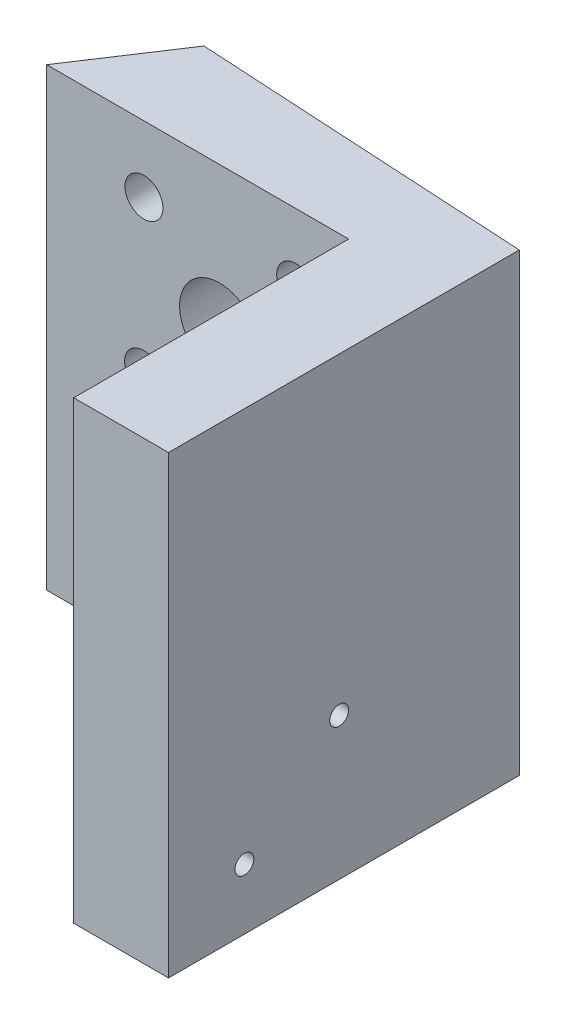
ISO-10303-21;
HEADER;
FILE_DESCRIPTION(('STEP AP214'),'2;1');
FILE_NAME('part.step','',(''),(''),'','','');
FILE_SCHEMA(('AUTOMOTIVE_DESIGN { 1 0 10303 214 1 1 1 1 }'));
ENDSEC;
DATA;
#1=APPLICATION_CONTEXT('core data for automotive mechanical design processes');
#2=APPLICATION_PROTOCOL_DEFINITION('international standard','automotive_design',2000,#1);
#3=PRODUCT_CONTEXT('',#1,'mechanical');
#4=PRODUCT('Part','Part','',(#3));
#5=PRODUCT_RELATED_PRODUCT_CATEGORY('part','',(#4));
#6=PRODUCT_DEFINITION_FORMATION('','',#4);
#7=PRODUCT_DEFINITION_CONTEXT('part definition',#1,'design');
#8=PRODUCT_DEFINITION('design','',#6,#7);
#9=PRODUCT_DEFINITION_SHAPE('','',#8);
#10=(LENGTH_UNIT() NAMED_UNIT(*) SI_UNIT(.MILLI.,.METRE.));
#11=(NAMED_UNIT(*) PLANE_ANGLE_UNIT() SI_UNIT($,.RADIAN.));
#12=(NAMED_UNIT(*) SI_UNIT($,.STERADIAN.) SOLID_ANGLE_UNIT());
#13=UNCERTAINTY_MEASURE_WITH_UNIT(LENGTH_MEASURE(1.E-05),#10,'distance_accuracy_value','');
#14=(GEOMETRIC_REPRESENTATION_CONTEXT(3) GLOBAL_UNCERTAINTY_ASSIGNED_CONTEXT((#13)) GLOBAL_UNIT_ASSIGNED_CONTEXT((#10,
#11,#12)) REPRESENTATION_CONTEXT('',''));
#15=CARTESIAN_POINT('',(0.,0.,0.));
#16=DIRECTION('',(0.,0.,1.));
#17=DIRECTION('',(1.,0.,0.));
#18=AXIS2_PLACEMENT_3D('',#15,#16,#17);
#19=CARTESIAN_POINT('',(0.,48.,0.));
#20=DIRECTION('',(0.,0.,1.));
#21=DIRECTION('',(1.,0.,0.));
#22=AXIS2_PLACEMENT_3D('',#19,#20,#21);
#23=PLANE('',#22);
#24=CARTESIAN_POINT('',(-5.62968108342815,24.9790510727815,0.));
#25=DIRECTION('',(0.,0.,1.));
#26=DIRECTION('',(1.,0.,0.));
#27=AXIS2_PLACEMENT_3D('',#24,#25,#26);
#28=CIRCLE('',#27,2.);
#29=CARTESIAN_POINT('',(-3.62968108342815,24.9790510727815,0.));
#30=VERTEX_POINT('',#29);
#31=EDGE_CURVE('E145',#30,#30,#28,.T.);
#32=ORIENTED_EDGE('',*,*,#31,.F.);
#33=EDGE_LOOP('',(#32));
#34=FACE_BOUND('',#33,.T.);
#35=CARTESIAN_POINT('',(-21.5913355474178,41.0209489272188,0.));
#36=DIRECTION('',(0.,0.,1.));
#37=DIRECTION('',(1.,0.,0.));
#38=AXIS2_PLACEMENT_3D('',#35,#36,#37);
#39=CIRCLE('',#38,2.);
#40=CARTESIAN_POINT('',(-19.5913355474178,41.0209489272188,0.));
#41=VERTEX_POINT('',#40);
#42=EDGE_CURVE('E146',#41,#41,#39,.T.);
#43=ORIENTED_EDGE('',*,*,#42,.F.);
#44=EDGE_LOOP('',(#43));
#45=FACE_BOUND('',#44,.T.);
#46=CARTESIAN_POINT('',(-21.6314572426416,25.0191727680053,0.));
#47=DIRECTION('',(0.,0.,1.));
#48=DIRECTION('',(1.,0.,0.));
#49=AXIS2_PLACEMENT_3D('',#46,#47,#48);
#50=CIRCLE('',#49,2.);
#51=CARTESIAN_POINT('',(-19.6314572426416,25.0191727680053,0.));
#52=VERTEX_POINT('',#51);
#53=EDGE_CURVE('E149',#52,#52,#50,.T.);
#54=ORIENTED_EDGE('',*,*,#53,.F.);
#55=EDGE_LOOP('',(#54));
#56=FACE_BOUND('',#55,.T.);
#57=CARTESIAN_POINT('',(-13.6296810834282,32.9790510727815,0.));
#58=DIRECTION('',(0.,0.,1.));
#59=DIRECTION('',(1.,0.,0.));
#60=AXIS2_PLACEMENT_3D('',#57,#58,#59);
#61=CIRCLE('',#60,4.2);
#62=CARTESIAN_POINT('',(-9.42968108342816,32.9790510727815,0.));
#63=VERTEX_POINT('',#62);
#64=EDGE_CURVE('E152',#63,#63,#61,.T.);
#65=ORIENTED_EDGE('',*,*,#64,.F.);
#66=EDGE_LOOP('',(#65));
#67=FACE_BOUND('',#66,.T.);
#68=CARTESIAN_POINT('',(-5.58955938820431,40.9808272319949,0.));
#69=DIRECTION('',(0.,0.,1.));
#70=DIRECTION('',(1.,0.,0.));
#71=AXIS2_PLACEMENT_3D('',#68,#69,#70);
#72=CIRCLE('',#71,2.00000000000001);
#73=CARTESIAN_POINT('',(-3.5895593882043,40.9808272319949,0.));
#74=VERTEX_POINT('',#73);
#75=EDGE_CURVE('E141',#74,#74,#72,.T.);
#76=ORIENTED_EDGE('',*,*,#75,.F.);
#77=EDGE_LOOP('',(#76));
#78=FACE_BOUND('',#77,.T.);
#79=DIRECTION('',(-1.,0.,0.));
#80=VECTOR('',#79,1.);
#81=CARTESIAN_POINT('',(0.,0.,0.));
#82=LINE('',#81,#80);
#83=CARTESIAN_POINT('',(0.,0.,0.));
#84=VERTEX_POINT('',#83);
#85=CARTESIAN_POINT('',(-31.85,0.,0.));
#86=VERTEX_POINT('',#85);
#87=EDGE_CURVE('E130',#84,#86,#82,.T.);
#88=ORIENTED_EDGE('',*,*,#87,.F.);
#89=DIRECTION('',(0.,-1.,0.));
#90=VECTOR('',#89,1.);
#91=CARTESIAN_POINT('',(0.,48.,0.));
#92=LINE('',#91,#90);
#93=CARTESIAN_POINT('',(0.,48.,0.));
#94=VERTEX_POINT('',#93);
#95=EDGE_CURVE('E41',#94,#84,#92,.T.);
#96=ORIENTED_EDGE('',*,*,#95,.F.);
#97=DIRECTION('',(-1.,0.,0.));
#98=VECTOR('',#97,1.);
#99=CARTESIAN_POINT('',(0.,48.,0.));
#100=LINE('',#99,#98);
#101=CARTESIAN_POINT('',(-31.85,48.,0.));
#102=VERTEX_POINT('',#101);
#103=EDGE_CURVE('E113',#94,#102,#100,.T.);
#104=ORIENTED_EDGE('',*,*,#103,.T.);
#105=DIRECTION('',(0.,-1.,0.));
#106=VECTOR('',#105,1.);
#107=CARTESIAN_POINT('',(-31.85,48.,0.));
#108=LINE('',#107,#106);
#109=EDGE_CURVE('E11',#102,#86,#108,.T.);
#110=ORIENTED_EDGE('',*,*,#109,.T.);
#111=EDGE_LOOP('',(#88,#96,#104,#110));
#112=FACE_BOUND('',#111,.T.);
#113=ADVANCED_FACE('F33',(#34,#45,#56,#67,#78,#112),#23,.T.);
#114=CARTESIAN_POINT('',(0.,48.,0.));
#115=DIRECTION('',(1.,0.,0.));
#116=DIRECTION('',(0.,0.,-1.));
#117=AXIS2_PLACEMENT_3D('',#114,#115,#116);
#118=PLANE('',#117);
#119=DIRECTION('',(0.,0.,1.));
#120=VECTOR('',#119,1.);
#121=CARTESIAN_POINT('',(0.,0.,0.));
#122=LINE('',#121,#120);
#123=CARTESIAN_POINT('',(0.,0.,29.));
#124=VERTEX_POINT('',#123);
#125=EDGE_CURVE('E117',#84,#124,#122,.T.);
#126=ORIENTED_EDGE('',*,*,#125,.T.);
#127=DIRECTION('',(0.,-1.,0.));
#128=VECTOR('',#127,1.);
#129=CARTESIAN_POINT('',(0.,48.,29.));
#130=LINE('',#129,#128);
#131=CARTESIAN_POINT('',(0.,48.,29.));
#132=VERTEX_POINT('',#131);
#133=EDGE_CURVE('E122',#132,#124,#130,.T.);
#134=ORIENTED_EDGE('',*,*,#133,.F.);
#135=DIRECTION('',(0.,0.,1.));
#136=VECTOR('',#135,1.);
#137=CARTESIAN_POINT('',(0.,48.,0.));
#138=LINE('',#137,#136);
#139=EDGE_CURVE('E115',#94,#132,#138,.T.);
#140=ORIENTED_EDGE('',*,*,#139,.F.);
#141=ORIENTED_EDGE('',*,*,#95,.T.);
#142=EDGE_LOOP('',(#126,#134,#140,#141));
#143=FACE_BOUND('',#142,.T.);
#144=ADVANCED_FACE('F127',(#143),#118,.F.);
#145=CARTESIAN_POINT('',(0.,48.,29.));
#146=DIRECTION('',(0.,0.,-1.));
#147=DIRECTION('',(-1.,0.,0.));
#148=AXIS2_PLACEMENT_3D('',#145,#146,#147);
#149=PLANE('',#148);
#150=DIRECTION('',(1.,0.,0.));
#151=VECTOR('',#150,1.);
#152=CARTESIAN_POINT('',(0.,0.,29.));
#153=LINE('',#152,#151);
#154=CARTESIAN_POINT('',(10.,0.,29.));
#155=VERTEX_POINT('',#154);
#156=EDGE_CURVE('E74',#124,#155,#153,.T.);
#157=ORIENTED_EDGE('',*,*,#156,.T.);
#158=DIRECTION('',(0.,-1.,0.));
#159=VECTOR('',#158,1.);
#160=CARTESIAN_POINT('',(10.,48.,29.));
#161=LINE('',#160,#159);
#162=CARTESIAN_POINT('',(10.,48.,29.));
#163=VERTEX_POINT('',#162);
#164=EDGE_CURVE('E112',#163,#155,#161,.T.);
#165=ORIENTED_EDGE('',*,*,#164,.F.);
#166=DIRECTION('',(1.,0.,0.));
#167=VECTOR('',#166,1.);
#168=CARTESIAN_POINT('',(0.,48.,29.));
#169=LINE('',#168,#167);
#170=EDGE_CURVE('E57',#132,#163,#169,.T.);
#171=ORIENTED_EDGE('',*,*,#170,.F.);
#172=ORIENTED_EDGE('',*,*,#133,.T.);
#173=EDGE_LOOP('',(#157,#165,#171,#172));
#174=FACE_BOUND('',#173,.T.);
#175=ADVANCED_FACE('F246',(#174),#149,.F.);
#176=CARTESIAN_POINT('',(10.,48.,0.));
#177=DIRECTION('',(-1.,0.,0.));
#178=DIRECTION('',(0.,0.,1.));
#179=AXIS2_PLACEMENT_3D('',#176,#177,#178);
#180=PLANE('',#179);
#181=CARTESIAN_POINT('',(10.,6.39194852200831,21.));
#182=DIRECTION('',(1.,0.,0.));
#183=DIRECTION('',(0.,0.,-1.));
#184=AXIS2_PLACEMENT_3D('',#181,#182,#183);
#185=CIRCLE('',#184,1.);
#186=CARTESIAN_POINT('',(10.,6.39194852200831,20.));
#187=VERTEX_POINT('',#186);
#188=EDGE_CURVE('E178',#187,#187,#185,.T.);
#189=ORIENTED_EDGE('',*,*,#188,.F.);
#190=EDGE_LOOP('',(#189));
#191=FACE_BOUND('',#190,.T.);
#192=CARTESIAN_POINT('',(10.,15.,11.));
#193=DIRECTION('',(1.,0.,0.));
#194=DIRECTION('',(0.,0.,-1.));
#195=AXIS2_PLACEMENT_3D('',#192,#193,#194);
#196=CIRCLE('',#195,0.999999999999999);
#197=CARTESIAN_POINT('',(10.,15.,10.));
#198=VERTEX_POINT('',#197);
#199=EDGE_CURVE('E171',#198,#198,#196,.T.);
#200=ORIENTED_EDGE('',*,*,#199,.F.);
#201=EDGE_LOOP('',(#200));
#202=FACE_BOUND('',#201,.T.);
#203=DIRECTION('',(0.,0.,-1.));
#204=VECTOR('',#203,1.);
#205=CARTESIAN_POINT('',(10.,0.,0.));
#206=LINE('',#205,#204);
#207=CARTESIAN_POINT('',(10.,0.,-8.));
#208=VERTEX_POINT('',#207);
#209=EDGE_CURVE('E107',#155,#208,#206,.T.);
#210=ORIENTED_EDGE('',*,*,#209,.T.);
#211=DIRECTION('',(0.,1.,0.));
#212=VECTOR('',#211,1.);
#213=CARTESIAN_POINT('',(10.,0.,-8.));
#214=LINE('',#213,#212);
#215=CARTESIAN_POINT('',(10.,48.,-8.));
#216=VERTEX_POINT('',#215);
#217=EDGE_CURVE('E94',#208,#216,#214,.T.);
#218=ORIENTED_EDGE('',*,*,#217,.T.);
#219=DIRECTION('',(0.,0.,-1.));
#220=VECTOR('',#219,1.);
#221=CARTESIAN_POINT('',(10.,48.,0.));
#222=LINE('',#221,#220);
#223=EDGE_CURVE('E123',#163,#216,#222,.T.);
#224=ORIENTED_EDGE('',*,*,#223,.F.);
#225=ORIENTED_EDGE('',*,*,#164,.T.);
#226=EDGE_LOOP('',(#210,#218,#224,#225));
#227=FACE_BOUND('',#226,.T.);
#228=ADVANCED_FACE('F111',(#191,#202,#227),#180,.F.);
#229=CARTESIAN_POINT('',(0.,48.,0.));
#230=DIRECTION('',(0.,1.,0.));
#231=DIRECTION('',(0.,0.,1.));
#232=AXIS2_PLACEMENT_3D('',#229,#230,#231);
#233=PLANE('',#232);
#234=DIRECTION('',(0.998395495392149,0.,0.0566253898941637));
#235=VECTOR('',#234,1.);
#236=CARTESIAN_POINT('',(-25.2631742495093,48.,-10.));
#237=LINE('',#236,#235);
#238=CARTESIAN_POINT('',(-25.2631742495093,48.,-10.));
#239=VERTEX_POINT('',#238);
#240=EDGE_CURVE('E98',#239,#216,#237,.T.);
#241=ORIENTED_EDGE('',*,*,#240,.F.);
#242=DIRECTION('',(0.550075605841365,0.,-0.835114859081226));
#243=VECTOR('',#242,1.);
#244=CARTESIAN_POINT('',(-25.2631742495093,48.,-10.));
#245=LINE('',#244,#243);
#246=EDGE_CURVE('E138',#102,#239,#245,.T.);
#247=ORIENTED_EDGE('',*,*,#246,.F.);
#248=ORIENTED_EDGE('',*,*,#103,.F.);
#249=ORIENTED_EDGE('',*,*,#139,.T.);
#250=ORIENTED_EDGE('',*,*,#170,.T.);
#251=ORIENTED_EDGE('',*,*,#223,.T.);
#252=EDGE_LOOP('',(#241,#247,#248,#249,#250,#251));
#253=FACE_BOUND('',#252,.T.);
#254=ADVANCED_FACE('F239',(#253),#233,.T.);
#255=CARTESIAN_POINT('',(0.,0.,0.));
#256=DIRECTION('',(0.,1.,0.));
#257=DIRECTION('',(0.,0.,1.));
#258=AXIS2_PLACEMENT_3D('',#255,#256,#257);
#259=PLANE('',#258);
#260=DIRECTION('',(0.550075605841365,0.,-0.835114859081226));
#261=VECTOR('',#260,1.);
#262=CARTESIAN_POINT('',(-25.2631742495093,0.,-10.));
#263=LINE('',#262,#261);
#264=CARTESIAN_POINT('',(-25.2631742495093,0.,-10.));
#265=VERTEX_POINT('',#264);
#266=EDGE_CURVE('E109',#86,#265,#263,.T.);
#267=ORIENTED_EDGE('',*,*,#266,.T.);
#268=DIRECTION('',(0.998395495392149,0.,0.0566253898941637));
#269=VECTOR('',#268,1.);
#270=CARTESIAN_POINT('',(-25.2631742495093,0.,-10.));
#271=LINE('',#270,#269);
#272=EDGE_CURVE('E48',#265,#208,#271,.T.);
#273=ORIENTED_EDGE('',*,*,#272,.T.);
#274=ORIENTED_EDGE('',*,*,#209,.F.);
#275=ORIENTED_EDGE('',*,*,#156,.F.);
#276=ORIENTED_EDGE('',*,*,#125,.F.);
#277=ORIENTED_EDGE('',*,*,#87,.T.);
#278=EDGE_LOOP('',(#267,#273,#274,#275,#276,#277));
#279=FACE_BOUND('',#278,.T.);
#280=ADVANCED_FACE('F106',(#279),#259,.F.);
#281=CARTESIAN_POINT('',(-25.2631742495093,0.,-10.));
#282=DIRECTION('',(0.835114859081226,0.,0.550075605841365));
#283=DIRECTION('',(0.550075605841365,0.,-0.835114859081226));
#284=AXIS2_PLACEMENT_3D('',#281,#282,#283);
#285=PLANE('',#284);
#286=ORIENTED_EDGE('',*,*,#246,.T.);
#287=DIRECTION('',(0.,1.,0.));
#288=VECTOR('',#287,1.);
#289=CARTESIAN_POINT('',(-25.2631742495093,0.,-10.));
#290=LINE('',#289,#288);
#291=EDGE_CURVE('E131',#265,#239,#290,.T.);
#292=ORIENTED_EDGE('',*,*,#291,.F.);
#293=ORIENTED_EDGE('',*,*,#266,.F.);
#294=ORIENTED_EDGE('',*,*,#109,.F.);
#295=EDGE_LOOP('',(#286,#292,#293,#294));
#296=FACE_BOUND('',#295,.T.);
#297=ADVANCED_FACE('F226',(#296),#285,.F.);
#298=CARTESIAN_POINT('',(-5.58955938820431,40.9808272319949,-48.));
#299=DIRECTION('',(0.,0.,1.));
#300=DIRECTION('',(1.,0.,0.));
#301=AXIS2_PLACEMENT_3D('',#298,#299,#300);
#302=CYLINDRICAL_SURFACE('',#301,2.00000000000001);
#303=CARTESIAN_POINT('',(-5.58955938820431,40.9808272319949,-8.88418355522384));
#304=DIRECTION('',(-0.0566253898941637,0.,0.998395495392149));
#305=DIRECTION('',(0.998395495392149,0.,0.0566253898941637));
#306=AXIS2_PLACEMENT_3D('',#303,#304,#305);
#307=ELLIPSE('',#306,2.00321416636045,2.00000000000001);
#308=CARTESIAN_POINT('',(-3.5895593882043,40.9808272319949,-8.77075077201216));
#309=VERTEX_POINT('',#308);
#310=EDGE_CURVE('E155',#309,#309,#307,.F.);
#311=ORIENTED_EDGE('',*,*,#310,.T.);
#312=EDGE_LOOP('',(#311));
#313=FACE_BOUND('',#312,.T.);
#314=ORIENTED_EDGE('',*,*,#75,.T.);
#315=EDGE_LOOP('',(#314));
#316=FACE_BOUND('',#315,.T.);
#317=ADVANCED_FACE('F223',(#313,#316),#302,.F.);
#318=CARTESIAN_POINT('',(-13.6296810834282,32.9790510727815,-48.));
#319=DIRECTION('',(0.,0.,1.));
#320=DIRECTION('',(1.,0.,0.));
#321=AXIS2_PLACEMENT_3D('',#318,#319,#320);
#322=CYLINDRICAL_SURFACE('',#321,4.2);
#323=CARTESIAN_POINT('',(-13.6296810834282,32.9790510727815,-9.34019024584873));
#324=DIRECTION('',(-0.0566253898941637,0.,0.998395495392149));
#325=DIRECTION('',(0.998395495392149,0.,0.0566253898941637));
#326=AXIS2_PLACEMENT_3D('',#323,#324,#325);
#327=ELLIPSE('',#326,4.20674974935692,4.2);
#328=CARTESIAN_POINT('',(-9.42968108342816,32.9790510727815,-9.10198140110422));
#329=VERTEX_POINT('',#328);
#330=EDGE_CURVE('E160',#329,#329,#327,.F.);
#331=ORIENTED_EDGE('',*,*,#330,.T.);
#332=EDGE_LOOP('',(#331));
#333=FACE_BOUND('',#332,.T.);
#334=ORIENTED_EDGE('',*,*,#64,.T.);
#335=EDGE_LOOP('',(#334));
#336=FACE_BOUND('',#335,.T.);
#337=ADVANCED_FACE('F225',(#333,#336),#322,.F.);
#338=CARTESIAN_POINT('',(-21.6314572426416,25.0191727680053,-48.));
#339=DIRECTION('',(0.,0.,1.));
#340=DIRECTION('',(1.,0.,0.));
#341=AXIS2_PLACEMENT_3D('',#338,#339,#340);
#342=CYLINDRICAL_SURFACE('',#341,2.);
#343=CARTESIAN_POINT('',(-21.6314572426416,25.0191727680053,-9.79402211603692));
#344=DIRECTION('',(-0.0566253898941637,0.,0.998395495392149));
#345=DIRECTION('',(0.998395495392149,0.,0.0566253898941637));
#346=AXIS2_PLACEMENT_3D('',#343,#344,#345);
#347=ELLIPSE('',#346,2.00321416636044,2.);
#348=CARTESIAN_POINT('',(-19.6314572426416,25.0191727680053,-9.68058933282525));
#349=VERTEX_POINT('',#348);
#350=EDGE_CURVE('E163',#349,#349,#347,.F.);
#351=ORIENTED_EDGE('',*,*,#350,.T.);
#352=EDGE_LOOP('',(#351));
#353=FACE_BOUND('',#352,.T.);
#354=ORIENTED_EDGE('',*,*,#53,.T.);
#355=EDGE_LOOP('',(#354));
#356=FACE_BOUND('',#355,.T.);
#357=ADVANCED_FACE('F210',(#353,#356),#342,.F.);
#358=CARTESIAN_POINT('',(-21.5913355474178,41.0209489272188,-48.));
#359=DIRECTION('',(0.,0.,1.));
#360=DIRECTION('',(1.,0.,0.));
#361=AXIS2_PLACEMENT_3D('',#358,#359,#360);
#362=CYLINDRICAL_SURFACE('',#361,2.);
#363=CARTESIAN_POINT('',(-21.5913355474178,41.0209489272188,-9.79174655825871));
#364=DIRECTION('',(-0.0566253898941637,0.,0.998395495392149));
#365=DIRECTION('',(0.998395495392149,0.,0.0566253898941637));
#366=AXIS2_PLACEMENT_3D('',#363,#364,#365);
#367=ELLIPSE('',#366,2.00321416636044,2.);
#368=CARTESIAN_POINT('',(-19.5913355474178,41.0209489272188,-9.67831377504704));
#369=VERTEX_POINT('',#368);
#370=EDGE_CURVE('E166',#369,#369,#367,.F.);
#371=ORIENTED_EDGE('',*,*,#370,.T.);
#372=EDGE_LOOP('',(#371));
#373=FACE_BOUND('',#372,.T.);
#374=ORIENTED_EDGE('',*,*,#42,.T.);
#375=EDGE_LOOP('',(#374));
#376=FACE_BOUND('',#375,.T.);
#377=ADVANCED_FACE('F207',(#373,#376),#362,.F.);
#378=CARTESIAN_POINT('',(-5.62968108342815,24.9790510727815,-48.));
#379=DIRECTION('',(0.,0.,1.));
#380=DIRECTION('',(1.,0.,0.));
#381=AXIS2_PLACEMENT_3D('',#378,#379,#380);
#382=CYLINDRICAL_SURFACE('',#381,2.);
#383=CARTESIAN_POINT('',(-5.62968108342815,24.9790510727815,-8.88645911300204));
#384=DIRECTION('',(-0.0566253898941637,0.,0.998395495392149));
#385=DIRECTION('',(0.998395495392149,0.,0.0566253898941637));
#386=AXIS2_PLACEMENT_3D('',#383,#384,#385);
#387=ELLIPSE('',#386,2.00321416636044,2.);
#388=CARTESIAN_POINT('',(-3.62968108342815,24.9790510727815,-8.77302632979037));
#389=VERTEX_POINT('',#388);
#390=EDGE_CURVE('E36',#389,#389,#387,.F.);
#391=ORIENTED_EDGE('',*,*,#390,.T.);
#392=EDGE_LOOP('',(#391));
#393=FACE_BOUND('',#392,.T.);
#394=ORIENTED_EDGE('',*,*,#31,.T.);
#395=EDGE_LOOP('',(#394));
#396=FACE_BOUND('',#395,.T.);
#397=ADVANCED_FACE('F201',(#393,#396),#382,.F.);
#398=CARTESIAN_POINT('',(-25.2631742495093,0.,-10.));
#399=DIRECTION('',(-0.0566253898941637,0.,0.998395495392149));
#400=DIRECTION('',(0.998395495392149,0.,0.0566253898941637));
#401=AXIS2_PLACEMENT_3D('',#398,#399,#400);
#402=PLANE('',#401);
#403=CARTESIAN_POINT('',(-9.96790990784296,7.,-9.13250779788328));
#404=DIRECTION('',(0.0566253898941637,0.,-0.998395495392149));
#405=DIRECTION('',(-0.998395495392149,0.,-0.0566253898941637));
#406=AXIS2_PLACEMENT_3D('',#403,#404,#405);
#407=CIRCLE('',#406,1.);
#408=CARTESIAN_POINT('',(-10.9663054032351,7.,-9.18913318777744));
#409=VERTEX_POINT('',#408);
#410=EDGE_CURVE('E183',#409,#409,#407,.T.);
#411=ORIENTED_EDGE('',*,*,#410,.F.);
#412=EDGE_LOOP('',(#411));
#413=FACE_BOUND('',#412,.T.);
#414=ORIENTED_EDGE('',*,*,#330,.F.);
#415=EDGE_LOOP('',(#414));
#416=FACE_BOUND('',#415,.T.);
#417=ORIENTED_EDGE('',*,*,#370,.F.);
#418=EDGE_LOOP('',(#417));
#419=FACE_BOUND('',#418,.T.);
#420=ORIENTED_EDGE('',*,*,#240,.T.);
#421=ORIENTED_EDGE('',*,*,#217,.F.);
#422=ORIENTED_EDGE('',*,*,#272,.F.);
#423=ORIENTED_EDGE('',*,*,#291,.T.);
#424=EDGE_LOOP('',(#420,#421,#422,#423));
#425=FACE_BOUND('',#424,.T.);
#426=ORIENTED_EDGE('',*,*,#390,.F.);
#427=EDGE_LOOP('',(#426));
#428=FACE_BOUND('',#427,.T.);
#429=ORIENTED_EDGE('',*,*,#350,.F.);
#430=EDGE_LOOP('',(#429));
#431=FACE_BOUND('',#430,.T.);
#432=ORIENTED_EDGE('',*,*,#310,.F.);
#433=EDGE_LOOP('',(#432));
#434=FACE_BOUND('',#433,.T.);
#435=ADVANCED_FACE('F95',(#413,#416,#419,#425,#428,#431,#434),#402,.F.);
#436=CARTESIAN_POINT('',(8.,15.,11.));
#437=DIRECTION('',(1.,0.,0.));
#438=DIRECTION('',(0.,0.,-1.));
#439=AXIS2_PLACEMENT_3D('',#436,#437,#438);
#440=CYLINDRICAL_SURFACE('',#439,0.999999999999999);
#441=CARTESIAN_POINT('',(8.,15.,11.));
#442=DIRECTION('',(1.,0.,0.));
#443=DIRECTION('',(0.,0.,-1.));
#444=AXIS2_PLACEMENT_3D('',#441,#442,#443);
#445=CIRCLE('',#444,0.999999999999999);
#446=CARTESIAN_POINT('',(8.,15.,10.));
#447=VERTEX_POINT('',#446);
#448=EDGE_CURVE('E174',#447,#447,#445,.T.);
#449=ORIENTED_EDGE('',*,*,#448,.F.);
#450=EDGE_LOOP('',(#449));
#451=FACE_BOUND('',#450,.T.);
#452=ORIENTED_EDGE('',*,*,#199,.T.);
#453=EDGE_LOOP('',(#452));
#454=FACE_BOUND('',#453,.T.);
#455=ADVANCED_FACE('F200',(#451,#454),#440,.F.);
#456=CARTESIAN_POINT('',(8.,15.,11.));
#457=DIRECTION('',(1.,0.,0.));
#458=DIRECTION('',(0.,0.,-1.));
#459=AXIS2_PLACEMENT_3D('',#456,#457,#458);
#460=PLANE('',#459);
#461=ORIENTED_EDGE('',*,*,#448,.T.);
#462=EDGE_LOOP('',(#461));
#463=FACE_BOUND('',#462,.T.);
#464=ADVANCED_FACE('F321',(#463),#460,.T.);
#465=CARTESIAN_POINT('',(8.,6.39194852200831,21.));
#466=DIRECTION('',(1.,0.,0.));
#467=DIRECTION('',(0.,0.,-1.));
#468=AXIS2_PLACEMENT_3D('',#465,#466,#467);
#469=CYLINDRICAL_SURFACE('',#468,1.);
#470=CARTESIAN_POINT('',(8.,6.39194852200831,21.));
#471=DIRECTION('',(1.,0.,0.));
#472=DIRECTION('',(0.,0.,-1.));
#473=AXIS2_PLACEMENT_3D('',#470,#471,#472);
#474=CIRCLE('',#473,1.);
#475=CARTESIAN_POINT('',(8.,6.39194852200831,20.));
#476=VERTEX_POINT('',#475);
#477=EDGE_CURVE('E169',#476,#476,#474,.T.);
#478=ORIENTED_EDGE('',*,*,#477,.F.);
#479=EDGE_LOOP('',(#478));
#480=FACE_BOUND('',#479,.T.);
#481=ORIENTED_EDGE('',*,*,#188,.T.);
#482=EDGE_LOOP('',(#481));
#483=FACE_BOUND('',#482,.T.);
#484=ADVANCED_FACE('F329',(#480,#483),#469,.F.);
#485=CARTESIAN_POINT('',(8.,6.39194852200831,21.));
#486=DIRECTION('',(1.,0.,0.));
#487=DIRECTION('',(0.,0.,-1.));
#488=AXIS2_PLACEMENT_3D('',#485,#486,#487);
#489=PLANE('',#488);
#490=ORIENTED_EDGE('',*,*,#477,.T.);
#491=EDGE_LOOP('',(#490));
#492=FACE_BOUND('',#491,.T.);
#493=ADVANCED_FACE('F194',(#492),#489,.T.);
#494=CARTESIAN_POINT('',(-10.0245352977371,7.,-8.13411230249113));
#495=DIRECTION('',(0.0566253898941637,0.,-0.998395495392149));
#496=DIRECTION('',(-0.998395495392149,0.,-0.0566253898941637));
#497=AXIS2_PLACEMENT_3D('',#494,#495,#496);
#498=CYLINDRICAL_SURFACE('',#497,1.);
#499=CARTESIAN_POINT('',(-10.0245352977371,7.,-8.13411230249113));
#500=DIRECTION('',(0.0566253898941637,0.,-0.998395495392149));
#501=DIRECTION('',(-0.998395495392149,0.,-0.0566253898941637));
#502=AXIS2_PLACEMENT_3D('',#499,#500,#501);
#503=CIRCLE('',#502,1.);
#504=CARTESIAN_POINT('',(-11.0229307931293,7.,-8.19073769238529));
#505=VERTEX_POINT('',#504);
#506=EDGE_CURVE('E175',#505,#505,#503,.T.);
#507=ORIENTED_EDGE('',*,*,#506,.F.);
#508=EDGE_LOOP('',(#507));
#509=FACE_BOUND('',#508,.T.);
#510=ORIENTED_EDGE('',*,*,#410,.T.);
#511=EDGE_LOOP('',(#510));
#512=FACE_BOUND('',#511,.T.);
#513=ADVANCED_FACE('F191',(#509,#512),#498,.F.);
#514=CARTESIAN_POINT('',(-10.0245352977371,7.,-8.13411230249113));
#515=DIRECTION('',(0.0566253898941637,0.,-0.998395495392149));
#516=DIRECTION('',(-0.998395495392149,0.,-0.0566253898941637));
#517=AXIS2_PLACEMENT_3D('',#514,#515,#516);
#518=PLANE('',#517);
#519=ORIENTED_EDGE('',*,*,#506,.T.);
#520=EDGE_LOOP('',(#519));
#521=FACE_BOUND('',#520,.T.);
#522=ADVANCED_FACE('F189',(#521),#518,.T.);
#523=CLOSED_SHELL('',(#113,#144,#175,#228,#254,#280,#297,#317,#337,#357,#377,#397,#435,#455,
#464,#484,#493,#513,#522));
#524=MANIFOLD_SOLID_BREP('B2',#523);
#525=ADVANCED_BREP_SHAPE_REPRESENTATION('',(#18,#524),#14);
#526=SHAPE_DEFINITION_REPRESENTATION(#9,#525);
ENDSEC;
END-ISO-10303-21;
